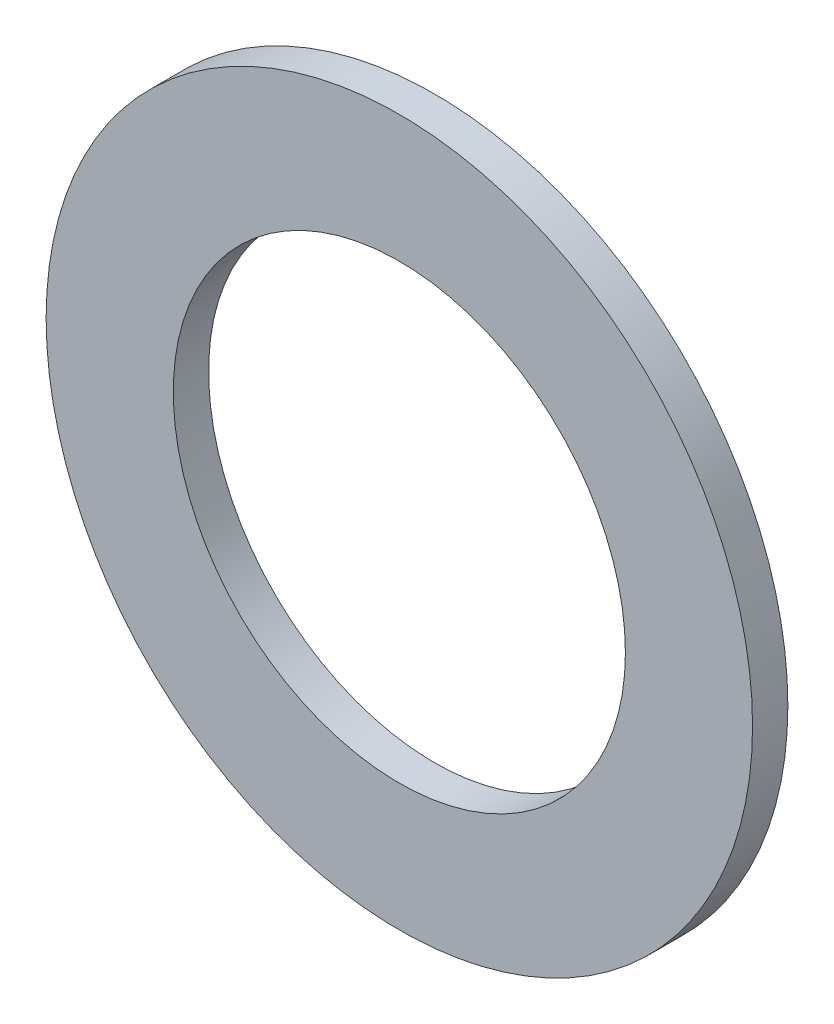
ISO-10303-21;
HEADER;
FILE_DESCRIPTION(('STEP AP214'),'2;1');
FILE_NAME('part.step','',(''),(''),'','','');
FILE_SCHEMA(('AUTOMOTIVE_DESIGN { 1 0 10303 214 1 1 1 1 }'));
ENDSEC;
DATA;
#1=APPLICATION_CONTEXT('core data for automotive mechanical design processes');
#2=APPLICATION_PROTOCOL_DEFINITION('international standard','automotive_design',2000,#1);
#3=PRODUCT_CONTEXT('',#1,'mechanical');
#4=PRODUCT('Part','Part','',(#3));
#5=PRODUCT_RELATED_PRODUCT_CATEGORY('part','',(#4));
#6=PRODUCT_DEFINITION_FORMATION('','',#4);
#7=PRODUCT_DEFINITION_CONTEXT('part definition',#1,'design');
#8=PRODUCT_DEFINITION('design','',#6,#7);
#9=PRODUCT_DEFINITION_SHAPE('','',#8);
#10=(LENGTH_UNIT() NAMED_UNIT(*) SI_UNIT(.MILLI.,.METRE.));
#11=(NAMED_UNIT(*) PLANE_ANGLE_UNIT() SI_UNIT($,.RADIAN.));
#12=(NAMED_UNIT(*) SI_UNIT($,.STERADIAN.) SOLID_ANGLE_UNIT());
#13=UNCERTAINTY_MEASURE_WITH_UNIT(LENGTH_MEASURE(1.E-05),#10,'distance_accuracy_value','');
#14=(GEOMETRIC_REPRESENTATION_CONTEXT(3) GLOBAL_UNCERTAINTY_ASSIGNED_CONTEXT((#13)) GLOBAL_UNIT_ASSIGNED_CONTEXT((#10,
#11,#12)) REPRESENTATION_CONTEXT('',''));
#15=CARTESIAN_POINT('',(0.,0.,0.));
#16=DIRECTION('',(0.,0.,1.));
#17=DIRECTION('',(1.,0.,0.));
#18=AXIS2_PLACEMENT_3D('',#15,#16,#17);
#19=CARTESIAN_POINT('',(0.,0.,1.98374));
#20=DIRECTION('',(0.,0.,1.));
#21=DIRECTION('',(1.,0.,0.));
#22=AXIS2_PLACEMENT_3D('',#19,#20,#21);
#23=PLANE('',#22);
#24=CARTESIAN_POINT('',(0.,0.,1.98374));
#25=DIRECTION('',(0.,0.,1.));
#26=DIRECTION('',(1.,0.,0.));
#27=AXIS2_PLACEMENT_3D('',#24,#25,#26);
#28=CIRCLE('',#27,19.84375);
#29=CARTESIAN_POINT('',(19.84375,0.,1.98374));
#30=VERTEX_POINT('',#29);
#31=EDGE_CURVE('E10',#30,#30,#28,.T.);
#32=ORIENTED_EDGE('',*,*,#31,.T.);
#33=EDGE_LOOP('',(#32));
#34=FACE_BOUND('',#33,.T.);
#35=CARTESIAN_POINT('',(0.,0.,1.98374));
#36=DIRECTION('',(0.,0.,1.));
#37=DIRECTION('',(1.,0.,0.));
#38=AXIS2_PLACEMENT_3D('',#35,#36,#37);
#39=CIRCLE('',#38,12.7);
#40=CARTESIAN_POINT('',(12.7,0.,1.98374));
#41=VERTEX_POINT('',#40);
#42=EDGE_CURVE('E48',#41,#41,#39,.T.);
#43=ORIENTED_EDGE('',*,*,#42,.F.);
#44=EDGE_LOOP('',(#43));
#45=FACE_BOUND('',#44,.T.);
#46=ADVANCED_FACE('F37',(#34,#45),#23,.T.);
#47=CARTESIAN_POINT('',(0.,0.,0.));
#48=DIRECTION('',(0.,0.,1.));
#49=DIRECTION('',(1.,0.,0.));
#50=AXIS2_PLACEMENT_3D('',#47,#48,#49);
#51=PLANE('',#50);
#52=CARTESIAN_POINT('',(0.,0.,0.));
#53=DIRECTION('',(0.,0.,1.));
#54=DIRECTION('',(1.,0.,0.));
#55=AXIS2_PLACEMENT_3D('',#52,#53,#54);
#56=CIRCLE('',#55,19.84375);
#57=CARTESIAN_POINT('',(19.84375,0.,0.));
#58=VERTEX_POINT('',#57);
#59=EDGE_CURVE('E41',#58,#58,#56,.T.);
#60=ORIENTED_EDGE('',*,*,#59,.F.);
#61=EDGE_LOOP('',(#60));
#62=FACE_BOUND('',#61,.T.);
#63=CARTESIAN_POINT('',(0.,0.,0.));
#64=DIRECTION('',(0.,0.,1.));
#65=DIRECTION('',(1.,0.,0.));
#66=AXIS2_PLACEMENT_3D('',#63,#64,#65);
#67=CIRCLE('',#66,12.7);
#68=CARTESIAN_POINT('',(12.7,0.,0.));
#69=VERTEX_POINT('',#68);
#70=EDGE_CURVE('E50',#69,#69,#67,.T.);
#71=ORIENTED_EDGE('',*,*,#70,.T.);
#72=EDGE_LOOP('',(#71));
#73=FACE_BOUND('',#72,.T.);
#74=ADVANCED_FACE('F60',(#62,#73),#51,.F.);
#75=CARTESIAN_POINT('',(0.,0.,1.98374));
#76=DIRECTION('',(0.,0.,-1.));
#77=DIRECTION('',(-1.,0.,0.));
#78=AXIS2_PLACEMENT_3D('',#75,#76,#77);
#79=CYLINDRICAL_SURFACE('',#78,19.84375);
#80=ORIENTED_EDGE('',*,*,#31,.F.);
#81=EDGE_LOOP('',(#80));
#82=FACE_BOUND('',#81,.T.);
#83=ORIENTED_EDGE('',*,*,#59,.T.);
#84=EDGE_LOOP('',(#83));
#85=FACE_BOUND('',#84,.T.);
#86=ADVANCED_FACE('F39',(#82,#85),#79,.T.);
#87=CARTESIAN_POINT('',(0.,0.,1.98374));
#88=DIRECTION('',(0.,0.,-1.));
#89=DIRECTION('',(-1.,0.,0.));
#90=AXIS2_PLACEMENT_3D('',#87,#88,#89);
#91=CYLINDRICAL_SURFACE('',#90,12.7);
#92=ORIENTED_EDGE('',*,*,#42,.T.);
#93=EDGE_LOOP('',(#92));
#94=FACE_BOUND('',#93,.T.);
#95=ORIENTED_EDGE('',*,*,#70,.F.);
#96=EDGE_LOOP('',(#95));
#97=FACE_BOUND('',#96,.T.);
#98=ADVANCED_FACE('F56',(#94,#97),#91,.F.);
#99=CLOSED_SHELL('',(#46,#74,#86,#98));
#100=MANIFOLD_SOLID_BREP('B2',#99);
#101=ADVANCED_BREP_SHAPE_REPRESENTATION('',(#18,#100),#14);
#102=SHAPE_DEFINITION_REPRESENTATION(#9,#101);
ENDSEC;
END-ISO-10303-21;
